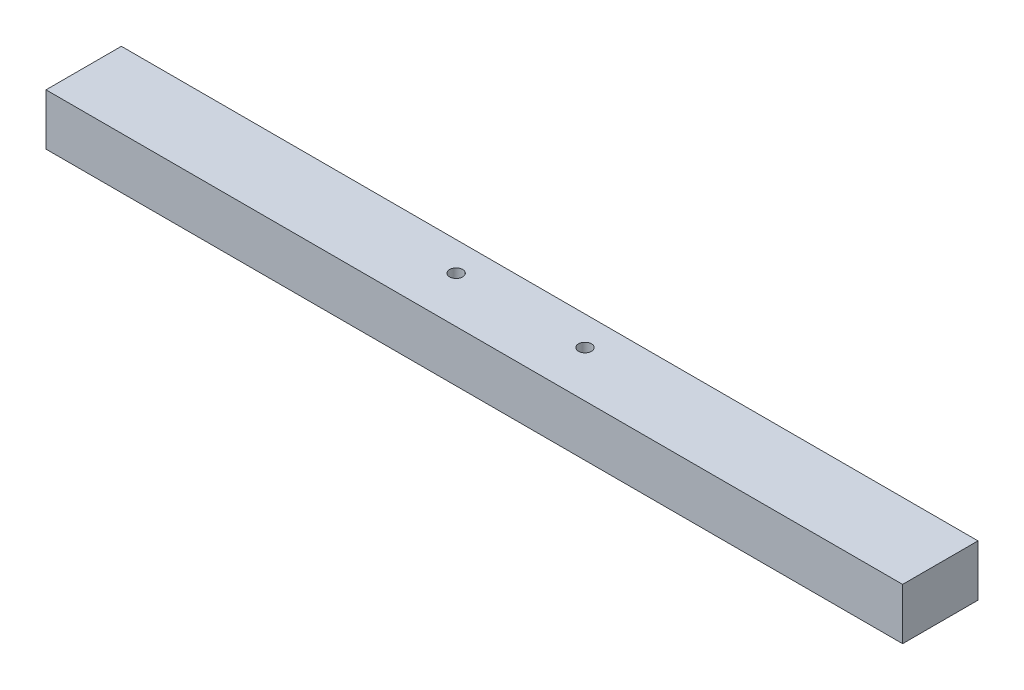
ISO-10303-21;
HEADER;
FILE_DESCRIPTION(('STEP AP214'),'2;1');
FILE_NAME('part.step','',(''),(''),'','','');
FILE_SCHEMA(('AUTOMOTIVE_DESIGN { 1 0 10303 214 1 1 1 1 }'));
ENDSEC;
DATA;
#1=APPLICATION_CONTEXT('core data for automotive mechanical design processes');
#2=APPLICATION_PROTOCOL_DEFINITION('international standard','automotive_design',2000,#1);
#3=PRODUCT_CONTEXT('',#1,'mechanical');
#4=PRODUCT('Part','Part','',(#3));
#5=PRODUCT_RELATED_PRODUCT_CATEGORY('part','',(#4));
#6=PRODUCT_DEFINITION_FORMATION('','',#4);
#7=PRODUCT_DEFINITION_CONTEXT('part definition',#1,'design');
#8=PRODUCT_DEFINITION('design','',#6,#7);
#9=PRODUCT_DEFINITION_SHAPE('','',#8);
#10=(LENGTH_UNIT() NAMED_UNIT(*) SI_UNIT(.MILLI.,.METRE.));
#11=(NAMED_UNIT(*) PLANE_ANGLE_UNIT() SI_UNIT($,.RADIAN.));
#12=(NAMED_UNIT(*) SI_UNIT($,.STERADIAN.) SOLID_ANGLE_UNIT());
#13=UNCERTAINTY_MEASURE_WITH_UNIT(LENGTH_MEASURE(1.E-05),#10,'distance_accuracy_value','');
#14=(GEOMETRIC_REPRESENTATION_CONTEXT(3) GLOBAL_UNCERTAINTY_ASSIGNED_CONTEXT((#13)) GLOBAL_UNIT_ASSIGNED_CONTEXT((#10,
#11,#12)) REPRESENTATION_CONTEXT('',''));
#15=CARTESIAN_POINT('',(0.,0.,0.));
#16=DIRECTION('',(0.,0.,1.));
#17=DIRECTION('',(1.,0.,0.));
#18=AXIS2_PLACEMENT_3D('',#15,#16,#17);
#19=CARTESIAN_POINT('',(0.,15.,0.));
#20=DIRECTION('',(0.,1.,0.));
#21=DIRECTION('',(0.,0.,1.));
#22=AXIS2_PLACEMENT_3D('',#19,#20,#21);
#23=PLANE('',#22);
#24=CARTESIAN_POINT('',(-18.8,15.,-2.5));
#25=DIRECTION('',(0.,1.,0.));
#26=DIRECTION('',(0.,0.,1.));
#27=AXIS2_PLACEMENT_3D('',#24,#25,#26);
#28=CIRCLE('',#27,1.9);
#29=CARTESIAN_POINT('',(-18.8,15.,-0.599999999999997));
#30=VERTEX_POINT('',#29);
#31=EDGE_CURVE('E100',#30,#30,#28,.T.);
#32=ORIENTED_EDGE('',*,*,#31,.F.);
#33=EDGE_LOOP('',(#32));
#34=FACE_BOUND('',#33,.T.);
#35=DIRECTION('',(0.,0.,1.));
#36=VECTOR('',#35,1.);
#37=CARTESIAN_POINT('',(-125.,15.,11.));
#38=LINE('',#37,#36);
#39=CARTESIAN_POINT('',(-125.,15.,-11.));
#40=VERTEX_POINT('',#39);
#41=CARTESIAN_POINT('',(-125.,15.,11.));
#42=VERTEX_POINT('',#41);
#43=EDGE_CURVE('E85',#40,#42,#38,.T.);
#44=ORIENTED_EDGE('',*,*,#43,.T.);
#45=DIRECTION('',(1.,0.,0.));
#46=VECTOR('',#45,1.);
#47=CARTESIAN_POINT('',(125.,15.,11.));
#48=LINE('',#47,#46);
#49=CARTESIAN_POINT('',(125.,15.,11.));
#50=VERTEX_POINT('',#49);
#51=EDGE_CURVE('E80',#42,#50,#48,.T.);
#52=ORIENTED_EDGE('',*,*,#51,.T.);
#53=DIRECTION('',(0.,0.,-1.));
#54=VECTOR('',#53,1.);
#55=CARTESIAN_POINT('',(125.,15.,11.));
#56=LINE('',#55,#54);
#57=CARTESIAN_POINT('',(125.,15.,-11.));
#58=VERTEX_POINT('',#57);
#59=EDGE_CURVE('E83',#50,#58,#56,.T.);
#60=ORIENTED_EDGE('',*,*,#59,.T.);
#61=DIRECTION('',(-1.,0.,0.));
#62=VECTOR('',#61,1.);
#63=CARTESIAN_POINT('',(125.,15.,-11.));
#64=LINE('',#63,#62);
#65=EDGE_CURVE('E50',#58,#40,#64,.T.);
#66=ORIENTED_EDGE('',*,*,#65,.T.);
#67=EDGE_LOOP('',(#44,#52,#60,#66));
#68=FACE_BOUND('',#67,.T.);
#69=CARTESIAN_POINT('',(18.8,15.,-2.5));
#70=DIRECTION('',(0.,1.,0.));
#71=DIRECTION('',(0.,0.,1.));
#72=AXIS2_PLACEMENT_3D('',#69,#70,#71);
#73=CIRCLE('',#72,1.9);
#74=CARTESIAN_POINT('',(18.8,15.,-0.599999999999999));
#75=VERTEX_POINT('',#74);
#76=EDGE_CURVE('E115',#75,#75,#73,.T.);
#77=ORIENTED_EDGE('',*,*,#76,.F.);
#78=EDGE_LOOP('',(#77));
#79=FACE_BOUND('',#78,.T.);
#80=ADVANCED_FACE('F33',(#34,#68,#79),#23,.T.);
#81=CARTESIAN_POINT('',(0.,0.,0.));
#82=DIRECTION('',(0.,1.,0.));
#83=DIRECTION('',(0.,0.,1.));
#84=AXIS2_PLACEMENT_3D('',#81,#82,#83);
#85=PLANE('',#84);
#86=CARTESIAN_POINT('',(-18.8,0.,-2.5));
#87=DIRECTION('',(0.,1.,0.));
#88=DIRECTION('',(0.,0.,1.));
#89=AXIS2_PLACEMENT_3D('',#86,#87,#88);
#90=CIRCLE('',#89,1.9);
#91=CARTESIAN_POINT('',(-18.8,0.,-0.599999999999997));
#92=VERTEX_POINT('',#91);
#93=EDGE_CURVE('E112',#92,#92,#90,.T.);
#94=ORIENTED_EDGE('',*,*,#93,.T.);
#95=EDGE_LOOP('',(#94));
#96=FACE_BOUND('',#95,.T.);
#97=DIRECTION('',(0.,0.,1.));
#98=VECTOR('',#97,1.);
#99=CARTESIAN_POINT('',(-125.,0.,11.));
#100=LINE('',#99,#98);
#101=CARTESIAN_POINT('',(-125.,0.,-11.));
#102=VERTEX_POINT('',#101);
#103=CARTESIAN_POINT('',(-125.,0.,11.));
#104=VERTEX_POINT('',#103);
#105=EDGE_CURVE('E97',#102,#104,#100,.T.);
#106=ORIENTED_EDGE('',*,*,#105,.F.);
#107=DIRECTION('',(-1.,0.,0.));
#108=VECTOR('',#107,1.);
#109=CARTESIAN_POINT('',(125.,0.,-11.));
#110=LINE('',#109,#108);
#111=CARTESIAN_POINT('',(125.,0.,-11.));
#112=VERTEX_POINT('',#111);
#113=EDGE_CURVE('E73',#112,#102,#110,.T.);
#114=ORIENTED_EDGE('',*,*,#113,.F.);
#115=DIRECTION('',(0.,0.,-1.));
#116=VECTOR('',#115,1.);
#117=CARTESIAN_POINT('',(125.,0.,11.));
#118=LINE('',#117,#116);
#119=CARTESIAN_POINT('',(125.,0.,11.));
#120=VERTEX_POINT('',#119);
#121=EDGE_CURVE('E67',#120,#112,#118,.T.);
#122=ORIENTED_EDGE('',*,*,#121,.F.);
#123=DIRECTION('',(1.,0.,0.));
#124=VECTOR('',#123,1.);
#125=CARTESIAN_POINT('',(125.,0.,11.));
#126=LINE('',#125,#124);
#127=EDGE_CURVE('E89',#104,#120,#126,.T.);
#128=ORIENTED_EDGE('',*,*,#127,.F.);
#129=EDGE_LOOP('',(#106,#114,#122,#128));
#130=FACE_BOUND('',#129,.T.);
#131=CARTESIAN_POINT('',(18.8,0.,-2.5));
#132=DIRECTION('',(0.,1.,0.));
#133=DIRECTION('',(0.,0.,1.));
#134=AXIS2_PLACEMENT_3D('',#131,#132,#133);
#135=CIRCLE('',#134,1.9);
#136=CARTESIAN_POINT('',(18.8,0.,-0.599999999999999));
#137=VERTEX_POINT('',#136);
#138=EDGE_CURVE('E118',#137,#137,#135,.T.);
#139=ORIENTED_EDGE('',*,*,#138,.T.);
#140=EDGE_LOOP('',(#139));
#141=FACE_BOUND('',#140,.T.);
#142=ADVANCED_FACE('F108',(#96,#130,#141),#85,.F.);
#143=CARTESIAN_POINT('',(-125.,15.,11.));
#144=DIRECTION('',(1.,0.,0.));
#145=DIRECTION('',(0.,0.,-1.));
#146=AXIS2_PLACEMENT_3D('',#143,#144,#145);
#147=PLANE('',#146);
#148=ORIENTED_EDGE('',*,*,#105,.T.);
#149=DIRECTION('',(0.,-1.,0.));
#150=VECTOR('',#149,1.);
#151=CARTESIAN_POINT('',(-125.,15.,11.));
#152=LINE('',#151,#150);
#153=EDGE_CURVE('E11',#42,#104,#152,.T.);
#154=ORIENTED_EDGE('',*,*,#153,.F.);
#155=ORIENTED_EDGE('',*,*,#43,.F.);
#156=DIRECTION('',(0.,-1.,0.));
#157=VECTOR('',#156,1.);
#158=CARTESIAN_POINT('',(-125.,15.,-11.));
#159=LINE('',#158,#157);
#160=EDGE_CURVE('E93',#40,#102,#159,.T.);
#161=ORIENTED_EDGE('',*,*,#160,.T.);
#162=EDGE_LOOP('',(#148,#154,#155,#161));
#163=FACE_BOUND('',#162,.T.);
#164=ADVANCED_FACE('F35',(#163),#147,.F.);
#165=CARTESIAN_POINT('',(125.,15.,11.));
#166=DIRECTION('',(0.,0.,-1.));
#167=DIRECTION('',(-1.,0.,0.));
#168=AXIS2_PLACEMENT_3D('',#165,#166,#167);
#169=PLANE('',#168);
#170=ORIENTED_EDGE('',*,*,#127,.T.);
#171=DIRECTION('',(0.,-1.,0.));
#172=VECTOR('',#171,1.);
#173=CARTESIAN_POINT('',(125.,15.,11.));
#174=LINE('',#173,#172);
#175=EDGE_CURVE('E42',#50,#120,#174,.T.);
#176=ORIENTED_EDGE('',*,*,#175,.F.);
#177=ORIENTED_EDGE('',*,*,#51,.F.);
#178=ORIENTED_EDGE('',*,*,#153,.T.);
#179=EDGE_LOOP('',(#170,#176,#177,#178));
#180=FACE_BOUND('',#179,.T.);
#181=ADVANCED_FACE('F88',(#180),#169,.F.);
#182=CARTESIAN_POINT('',(125.,15.,11.));
#183=DIRECTION('',(-1.,0.,0.));
#184=DIRECTION('',(0.,0.,1.));
#185=AXIS2_PLACEMENT_3D('',#182,#183,#184);
#186=PLANE('',#185);
#187=ORIENTED_EDGE('',*,*,#121,.T.);
#188=DIRECTION('',(0.,-1.,0.));
#189=VECTOR('',#188,1.);
#190=CARTESIAN_POINT('',(125.,15.,-11.));
#191=LINE('',#190,#189);
#192=EDGE_CURVE('E90',#58,#112,#191,.T.);
#193=ORIENTED_EDGE('',*,*,#192,.F.);
#194=ORIENTED_EDGE('',*,*,#59,.F.);
#195=ORIENTED_EDGE('',*,*,#175,.T.);
#196=EDGE_LOOP('',(#187,#193,#194,#195));
#197=FACE_BOUND('',#196,.T.);
#198=ADVANCED_FACE('F91',(#197),#186,.F.);
#199=CARTESIAN_POINT('',(125.,15.,-11.));
#200=DIRECTION('',(0.,0.,1.));
#201=DIRECTION('',(1.,0.,0.));
#202=AXIS2_PLACEMENT_3D('',#199,#200,#201);
#203=PLANE('',#202);
#204=ORIENTED_EDGE('',*,*,#113,.T.);
#205=ORIENTED_EDGE('',*,*,#160,.F.);
#206=ORIENTED_EDGE('',*,*,#65,.F.);
#207=ORIENTED_EDGE('',*,*,#192,.T.);
#208=EDGE_LOOP('',(#204,#205,#206,#207));
#209=FACE_BOUND('',#208,.T.);
#210=ADVANCED_FACE('F105',(#209),#203,.F.);
#211=CARTESIAN_POINT('',(-18.8,15.,-2.5));
#212=DIRECTION('',(0.,-1.,0.));
#213=DIRECTION('',(0.,0.,-1.));
#214=AXIS2_PLACEMENT_3D('',#211,#212,#213);
#215=CYLINDRICAL_SURFACE('',#214,1.9);
#216=ORIENTED_EDGE('',*,*,#31,.T.);
#217=EDGE_LOOP('',(#216));
#218=FACE_BOUND('',#217,.T.);
#219=ORIENTED_EDGE('',*,*,#93,.F.);
#220=EDGE_LOOP('',(#219));
#221=FACE_BOUND('',#220,.T.);
#222=ADVANCED_FACE('F136',(#218,#221),#215,.F.);
#223=CARTESIAN_POINT('',(18.8,15.,-2.5));
#224=DIRECTION('',(0.,-1.,0.));
#225=DIRECTION('',(0.,0.,-1.));
#226=AXIS2_PLACEMENT_3D('',#223,#224,#225);
#227=CYLINDRICAL_SURFACE('',#226,1.9);
#228=ORIENTED_EDGE('',*,*,#76,.T.);
#229=EDGE_LOOP('',(#228));
#230=FACE_BOUND('',#229,.T.);
#231=ORIENTED_EDGE('',*,*,#138,.F.);
#232=EDGE_LOOP('',(#231));
#233=FACE_BOUND('',#232,.T.);
#234=ADVANCED_FACE('F124',(#230,#233),#227,.F.);
#235=CLOSED_SHELL('',(#80,#142,#164,#181,#198,#210,#222,#234));
#236=MANIFOLD_SOLID_BREP('B2',#235);
#237=ADVANCED_BREP_SHAPE_REPRESENTATION('',(#18,#236),#14);
#238=SHAPE_DEFINITION_REPRESENTATION(#9,#237);
ENDSEC;
END-ISO-10303-21;
